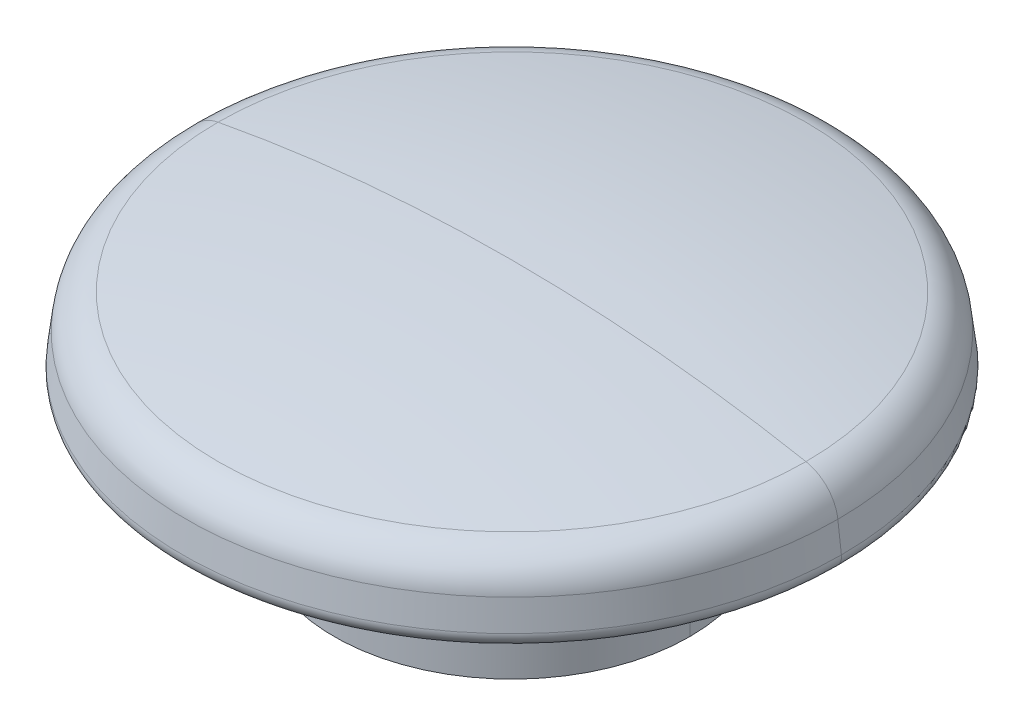
ISO-10303-21;
HEADER;
FILE_DESCRIPTION(('STEP AP214'),'2;1');
FILE_NAME('part.step','',(''),(''),'','','');
FILE_SCHEMA(('AUTOMOTIVE_DESIGN { 1 0 10303 214 1 1 1 1 }'));
ENDSEC;
DATA;
#1=APPLICATION_CONTEXT('core data for automotive mechanical design processes');
#2=APPLICATION_PROTOCOL_DEFINITION('international standard','automotive_design',2000,#1);
#3=PRODUCT_CONTEXT('',#1,'mechanical');
#4=PRODUCT('Part','Part','',(#3));
#5=PRODUCT_RELATED_PRODUCT_CATEGORY('part','',(#4));
#6=PRODUCT_DEFINITION_FORMATION('','',#4);
#7=PRODUCT_DEFINITION_CONTEXT('part definition',#1,'design');
#8=PRODUCT_DEFINITION('design','',#6,#7);
#9=PRODUCT_DEFINITION_SHAPE('','',#8);
#10=(LENGTH_UNIT() NAMED_UNIT(*) SI_UNIT(.MILLI.,.METRE.));
#11=(NAMED_UNIT(*) PLANE_ANGLE_UNIT() SI_UNIT($,.RADIAN.));
#12=(NAMED_UNIT(*) SI_UNIT($,.STERADIAN.) SOLID_ANGLE_UNIT());
#13=UNCERTAINTY_MEASURE_WITH_UNIT(LENGTH_MEASURE(1.E-05),#10,'distance_accuracy_value','');
#14=(GEOMETRIC_REPRESENTATION_CONTEXT(3) GLOBAL_UNCERTAINTY_ASSIGNED_CONTEXT((#13)) GLOBAL_UNIT_ASSIGNED_CONTEXT((#10,
#11,#12)) REPRESENTATION_CONTEXT('',''));
#15=CARTESIAN_POINT('',(0.,0.,0.));
#16=DIRECTION('',(0.,0.,1.));
#17=DIRECTION('',(1.,0.,0.));
#18=AXIS2_PLACEMENT_3D('',#15,#16,#17);
#19=CARTESIAN_POINT('',(0.,-11.2,0.));
#20=DIRECTION('',(0.,-1.,0.));
#21=DIRECTION('',(1.,0.,0.));
#22=AXIS2_PLACEMENT_3D('',#19,#20,#21);
#23=SPHERICAL_SURFACE('',#22,12.);
#24=CARTESIAN_POINT('',(0.,0.5907960026841,0.));
#25=DIRECTION('',(0.,1.,0.));
#26=DIRECTION('',(-1.,0.,0.));
#27=AXIS2_PLACEMENT_3D('',#24,#25,#26);
#28=CIRCLE('',#27,2.230948144419);
#29=CARTESIAN_POINT('',(-2.230948144419,0.5907960026841,0.));
#30=VERTEX_POINT('',#29);
#31=CARTESIAN_POINT('',(2.230948144419,0.5907960026841,0.));
#32=VERTEX_POINT('',#31);
#33=EDGE_CURVE('E200',#30,#32,#28,.T.);
#34=ORIENTED_EDGE('',*,*,#33,.T.);
#35=CARTESIAN_POINT('',(0.,-11.2,0.));
#36=DIRECTION('',(0.,0.,1.));
#37=DIRECTION('',(0.185912345368301,0.982566333557006,0.));
#38=AXIS2_PLACEMENT_3D('',#35,#36,#37);
#39=CIRCLE('',#38,12.);
#40=CARTESIAN_POINT('',(0.,0.8,0.));
#41=VERTEX_POINT('',#40);
#42=EDGE_CURVE('E25',#32,#41,#39,.T.);
#43=ORIENTED_EDGE('',*,*,#42,.T.);
#44=CARTESIAN_POINT('',(0.,-11.2,0.));
#45=DIRECTION('',(0.,0.,-1.));
#46=DIRECTION('',(-0.185912345368301,0.982566333557006,0.));
#47=AXIS2_PLACEMENT_3D('',#44,#45,#46);
#48=CIRCLE('',#47,12.);
#49=EDGE_CURVE('E11',#30,#41,#48,.T.);
#50=ORIENTED_EDGE('',*,*,#49,.F.);
#51=EDGE_LOOP('',(#34,#43,#50));
#52=FACE_BOUND('',#51,.T.);
#53=ADVANCED_FACE('F17',(#52),#23,.T.);
#54=CARTESIAN_POINT('',(0.,-11.2,0.));
#55=DIRECTION('',(0.,-1.,0.));
#56=DIRECTION('',(1.,0.,0.));
#57=AXIS2_PLACEMENT_3D('',#54,#55,#56);
#58=SPHERICAL_SURFACE('',#57,12.);
#59=ORIENTED_EDGE('',*,*,#42,.F.);
#60=CARTESIAN_POINT('',(0.,0.5907960026841,0.));
#61=DIRECTION('',(0.,-1.,0.));
#62=DIRECTION('',(-1.,0.,0.));
#63=AXIS2_PLACEMENT_3D('',#60,#61,#62);
#64=CIRCLE('',#63,2.230948144419);
#65=EDGE_CURVE('E207',#30,#32,#64,.T.);
#66=ORIENTED_EDGE('',*,*,#65,.F.);
#67=ORIENTED_EDGE('',*,*,#49,.T.);
#68=EDGE_LOOP('',(#59,#66,#67));
#69=FACE_BOUND('',#68,.T.);
#70=ADVANCED_FACE('F213',(#69),#58,.T.);
#71=CARTESIAN_POINT('',(0.,0.296026102617,0.));
#72=DIRECTION('',(0.,-1.,0.));
#73=DIRECTION('',(1.,0.,0.));
#74=AXIS2_PLACEMENT_3D('',#71,#72,#73);
#75=TOROIDAL_SURFACE('',#74,2.175174440809,0.3);
#76=ORIENTED_EDGE('',*,*,#65,.T.);
#77=CARTESIAN_POINT('',(2.175174440809,0.296026102617,0.));
#78=DIRECTION('',(0.,0.,1.));
#79=DIRECTION('',(0.992546151641328,0.121869343405103,0.));
#80=AXIS2_PLACEMENT_3D('',#77,#78,#79);
#81=CIRCLE('',#80,0.3);
#82=CARTESIAN_POINT('',(2.472938286301,0.3325869056386,0.));
#83=VERTEX_POINT('',#82);
#84=EDGE_CURVE('E196',#83,#32,#81,.T.);
#85=ORIENTED_EDGE('',*,*,#84,.F.);
#86=CARTESIAN_POINT('',(0.,0.3325869056386,0.));
#87=DIRECTION('',(0.,-1.,0.));
#88=DIRECTION('',(-1.,0.,0.));
#89=AXIS2_PLACEMENT_3D('',#86,#87,#88);
#90=CIRCLE('',#89,2.472938286301);
#91=CARTESIAN_POINT('',(-2.472938286301,0.3325869056386,0.));
#92=VERTEX_POINT('',#91);
#93=EDGE_CURVE('E152',#92,#83,#90,.T.);
#94=ORIENTED_EDGE('',*,*,#93,.F.);
#95=CARTESIAN_POINT('',(-2.175174440809,0.296026102617,0.));
#96=DIRECTION('',(0.,0.,-1.));
#97=DIRECTION('',(-0.992546151641328,0.121869343405103,0.));
#98=AXIS2_PLACEMENT_3D('',#95,#96,#97);
#99=CIRCLE('',#98,0.3);
#100=EDGE_CURVE('E203',#92,#30,#99,.T.);
#101=ORIENTED_EDGE('',*,*,#100,.T.);
#102=EDGE_LOOP('',(#76,#85,#94,#101));
#103=FACE_BOUND('',#102,.T.);
#104=ADVANCED_FACE('F215',(#103),#75,.T.);
#105=CARTESIAN_POINT('',(0.,0.296026102617,0.));
#106=DIRECTION('',(0.,-1.,0.));
#107=DIRECTION('',(1.,0.,0.));
#108=AXIS2_PLACEMENT_3D('',#105,#106,#107);
#109=TOROIDAL_SURFACE('',#108,2.175174440809,0.3);
#110=CARTESIAN_POINT('',(0.,0.3325869056386,0.));
#111=DIRECTION('',(0.,1.,0.));
#112=DIRECTION('',(-1.,0.,0.));
#113=AXIS2_PLACEMENT_3D('',#110,#111,#112);
#114=CIRCLE('',#113,2.472938286301);
#115=EDGE_CURVE('E192',#92,#83,#114,.T.);
#116=ORIENTED_EDGE('',*,*,#115,.T.);
#117=ORIENTED_EDGE('',*,*,#84,.T.);
#118=ORIENTED_EDGE('',*,*,#33,.F.);
#119=ORIENTED_EDGE('',*,*,#100,.F.);
#120=EDGE_LOOP('',(#116,#117,#118,#119));
#121=FACE_BOUND('',#120,.T.);
#122=ADVANCED_FACE('F220',(#121),#109,.T.);
#123=CARTESIAN_POINT('',(0.,0.2223869199895,0.));
#124=DIRECTION('',(0.,-1.,0.));
#125=DIRECTION('',(1.,0.,0.));
#126=AXIS2_PLACEMENT_3D('',#123,#124,#125);
#127=CONICAL_SURFACE('',#126,2.486469143151,0.12217304763958);
#128=CARTESIAN_POINT('',(0.,0.1121869343405,0.));
#129=DIRECTION('',(0.,1.,0.));
#130=DIRECTION('',(-1.,0.,0.));
#131=AXIS2_PLACEMENT_3D('',#128,#129,#130);
#132=CIRCLE('',#131,2.5);
#133=CARTESIAN_POINT('',(-2.5,0.1121869343405,0.));
#134=VERTEX_POINT('',#133);
#135=CARTESIAN_POINT('',(2.5,0.1121869343405,0.));
#136=VERTEX_POINT('',#135);
#137=EDGE_CURVE('E179',#134,#136,#132,.T.);
#138=ORIENTED_EDGE('',*,*,#137,.T.);
#139=DIRECTION('',(-0.121869343405202,0.992546151641315,0.));
#140=VECTOR('',#139,1.);
#141=CARTESIAN_POINT('',(2.5,0.1121869343405,0.));
#142=LINE('',#141,#140);
#143=EDGE_CURVE('E154',#136,#83,#142,.T.);
#144=ORIENTED_EDGE('',*,*,#143,.T.);
#145=ORIENTED_EDGE('',*,*,#115,.F.);
#146=DIRECTION('',(0.121869343405202,0.992546151641315,0.));
#147=VECTOR('',#146,1.);
#148=CARTESIAN_POINT('',(-2.5,0.1121869343405,0.));
#149=LINE('',#148,#147);
#150=EDGE_CURVE('E156',#134,#92,#149,.T.);
#151=ORIENTED_EDGE('',*,*,#150,.F.);
#152=EDGE_LOOP('',(#138,#144,#145,#151));
#153=FACE_BOUND('',#152,.T.);
#154=ADVANCED_FACE('F222',(#153),#127,.T.);
#155=CARTESIAN_POINT('',(0.,0.2223869199895,0.));
#156=DIRECTION('',(0.,-1.,0.));
#157=DIRECTION('',(1.,0.,0.));
#158=AXIS2_PLACEMENT_3D('',#155,#156,#157);
#159=CONICAL_SURFACE('',#158,2.486469143151,0.12217304763958);
#160=ORIENTED_EDGE('',*,*,#93,.T.);
#161=ORIENTED_EDGE('',*,*,#143,.F.);
#162=CARTESIAN_POINT('',(0.,0.1121869343405,0.));
#163=DIRECTION('',(0.,-1.,0.));
#164=DIRECTION('',(-1.,0.,0.));
#165=AXIS2_PLACEMENT_3D('',#162,#163,#164);
#166=CIRCLE('',#165,2.5);
#167=EDGE_CURVE('E188',#134,#136,#166,.T.);
#168=ORIENTED_EDGE('',*,*,#167,.F.);
#169=ORIENTED_EDGE('',*,*,#150,.T.);
#170=EDGE_LOOP('',(#160,#161,#168,#169));
#171=FACE_BOUND('',#170,.T.);
#172=ADVANCED_FACE('F227',(#171),#159,.T.);
#173=CARTESIAN_POINT('',(0.,0.1,0.));
#174=DIRECTION('',(0.,-1.,0.));
#175=DIRECTION('',(1.,0.,0.));
#176=AXIS2_PLACEMENT_3D('',#173,#174,#175);
#177=TOROIDAL_SURFACE('',#176,2.400745384836,0.1);
#178=ORIENTED_EDGE('',*,*,#167,.T.);
#179=CARTESIAN_POINT('',(2.400745384836,0.1,0.));
#180=DIRECTION('',(0.,0.,1.));
#181=DIRECTION('',(0.,-1.,0.));
#182=AXIS2_PLACEMENT_3D('',#179,#180,#181);
#183=CIRCLE('',#182,0.1);
#184=CARTESIAN_POINT('',(2.400745384836,0.,0.));
#185=VERTEX_POINT('',#184);
#186=EDGE_CURVE('E175',#185,#136,#183,.T.);
#187=ORIENTED_EDGE('',*,*,#186,.F.);
#188=CARTESIAN_POINT('',(0.,0.,0.));
#189=DIRECTION('',(0.,-1.,0.));
#190=DIRECTION('',(-1.,0.,0.));
#191=AXIS2_PLACEMENT_3D('',#188,#189,#190);
#192=CIRCLE('',#191,2.400745384836);
#193=CARTESIAN_POINT('',(-2.400745384836,0.,0.));
#194=VERTEX_POINT('',#193);
#195=EDGE_CURVE('E174',#194,#185,#192,.T.);
#196=ORIENTED_EDGE('',*,*,#195,.F.);
#197=CARTESIAN_POINT('',(-2.400745384836,0.1,0.));
#198=DIRECTION('',(0.,0.,-1.));
#199=DIRECTION('',(0.,-1.,0.));
#200=AXIS2_PLACEMENT_3D('',#197,#198,#199);
#201=CIRCLE('',#200,0.1);
#202=EDGE_CURVE('E184',#194,#134,#201,.T.);
#203=ORIENTED_EDGE('',*,*,#202,.T.);
#204=EDGE_LOOP('',(#178,#187,#196,#203));
#205=FACE_BOUND('',#204,.T.);
#206=ADVANCED_FACE('F288',(#205),#177,.T.);
#207=CARTESIAN_POINT('',(0.,0.1,0.));
#208=DIRECTION('',(0.,-1.,0.));
#209=DIRECTION('',(1.,0.,0.));
#210=AXIS2_PLACEMENT_3D('',#207,#208,#209);
#211=TOROIDAL_SURFACE('',#210,2.400745384836,0.1);
#212=CARTESIAN_POINT('',(0.,0.,0.));
#213=DIRECTION('',(0.,1.,0.));
#214=DIRECTION('',(-1.,0.,0.));
#215=AXIS2_PLACEMENT_3D('',#212,#213,#214);
#216=CIRCLE('',#215,2.400745384836);
#217=EDGE_CURVE('E180',#194,#185,#216,.T.);
#218=ORIENTED_EDGE('',*,*,#217,.T.);
#219=ORIENTED_EDGE('',*,*,#186,.T.);
#220=ORIENTED_EDGE('',*,*,#137,.F.);
#221=ORIENTED_EDGE('',*,*,#202,.F.);
#222=EDGE_LOOP('',(#218,#219,#220,#221));
#223=FACE_BOUND('',#222,.T.);
#224=ADVANCED_FACE('F290',(#223),#211,.T.);
#225=CARTESIAN_POINT('',(0.,0.,0.));
#226=DIRECTION('',(0.,-1.,0.));
#227=DIRECTION('',(0.,0.,-1.));
#228=AXIS2_PLACEMENT_3D('',#225,#226,#227);
#229=PLANE('',#228);
#230=CARTESIAN_POINT('',(0.,0.,0.));
#231=DIRECTION('',(0.,1.,0.));
#232=DIRECTION('',(-1.,0.,0.));
#233=AXIS2_PLACEMENT_3D('',#230,#231,#232);
#234=CIRCLE('',#233,1.35);
#235=CARTESIAN_POINT('',(-1.35,0.,0.));
#236=VERTEX_POINT('',#235);
#237=CARTESIAN_POINT('',(1.35,0.,0.));
#238=VERTEX_POINT('',#237);
#239=EDGE_CURVE('E162',#236,#238,#234,.T.);
#240=ORIENTED_EDGE('',*,*,#239,.T.);
#241=CARTESIAN_POINT('',(0.,0.,0.));
#242=DIRECTION('',(0.,-1.,0.));
#243=DIRECTION('',(-1.,0.,0.));
#244=AXIS2_PLACEMENT_3D('',#241,#242,#243);
#245=CIRCLE('',#244,1.35);
#246=EDGE_CURVE('E171',#236,#238,#245,.T.);
#247=ORIENTED_EDGE('',*,*,#246,.F.);
#248=EDGE_LOOP('',(#240,#247));
#249=FACE_BOUND('',#248,.T.);
#250=ORIENTED_EDGE('',*,*,#195,.T.);
#251=ORIENTED_EDGE('',*,*,#217,.F.);
#252=EDGE_LOOP('',(#250,#251));
#253=FACE_BOUND('',#252,.T.);
#254=ADVANCED_FACE('F287',(#249,#253),#229,.T.);
#255=CARTESIAN_POINT('',(0.,-0.1,0.));
#256=DIRECTION('',(0.,-1.,0.));
#257=DIRECTION('',(1.,0.,0.));
#258=AXIS2_PLACEMENT_3D('',#255,#256,#257);
#259=TOROIDAL_SURFACE('',#258,1.35,0.1);
#260=ORIENTED_EDGE('',*,*,#246,.T.);
#261=CARTESIAN_POINT('',(1.35,-0.1,0.));
#262=DIRECTION('',(0.,0.,-1.));
#263=DIRECTION('',(-1.,0.,0.));
#264=AXIS2_PLACEMENT_3D('',#261,#262,#263);
#265=CIRCLE('',#264,0.1);
#266=CARTESIAN_POINT('',(1.25,-0.1,0.));
#267=VERTEX_POINT('',#266);
#268=EDGE_CURVE('E158',#267,#238,#265,.T.);
#269=ORIENTED_EDGE('',*,*,#268,.F.);
#270=CARTESIAN_POINT('',(0.,-0.1,0.));
#271=DIRECTION('',(0.,-1.,0.));
#272=DIRECTION('',(-1.,0.,0.));
#273=AXIS2_PLACEMENT_3D('',#270,#271,#272);
#274=CIRCLE('',#273,1.25);
#275=CARTESIAN_POINT('',(-1.25,-0.1,0.));
#276=VERTEX_POINT('',#275);
#277=EDGE_CURVE('E261',#276,#267,#274,.T.);
#278=ORIENTED_EDGE('',*,*,#277,.F.);
#279=CARTESIAN_POINT('',(-1.35,-0.1,0.));
#280=DIRECTION('',(0.,0.,1.));
#281=DIRECTION('',(1.,0.,0.));
#282=AXIS2_PLACEMENT_3D('',#279,#280,#281);
#283=CIRCLE('',#282,0.1);
#284=EDGE_CURVE('E167',#276,#236,#283,.T.);
#285=ORIENTED_EDGE('',*,*,#284,.T.);
#286=EDGE_LOOP('',(#260,#269,#278,#285));
#287=FACE_BOUND('',#286,.T.);
#288=ADVANCED_FACE('F299',(#287),#259,.F.);
#289=CARTESIAN_POINT('',(0.,-0.1,0.));
#290=DIRECTION('',(0.,-1.,0.));
#291=DIRECTION('',(1.,0.,0.));
#292=AXIS2_PLACEMENT_3D('',#289,#290,#291);
#293=TOROIDAL_SURFACE('',#292,1.35,0.1);
#294=CARTESIAN_POINT('',(0.,-0.1,0.));
#295=DIRECTION('',(0.,1.,0.));
#296=DIRECTION('',(-1.,0.,0.));
#297=AXIS2_PLACEMENT_3D('',#294,#295,#296);
#298=CIRCLE('',#297,1.25);
#299=EDGE_CURVE('E163',#276,#267,#298,.T.);
#300=ORIENTED_EDGE('',*,*,#299,.T.);
#301=ORIENTED_EDGE('',*,*,#268,.T.);
#302=ORIENTED_EDGE('',*,*,#239,.F.);
#303=ORIENTED_EDGE('',*,*,#284,.F.);
#304=EDGE_LOOP('',(#300,#301,#302,#303));
#305=FACE_BOUND('',#304,.T.);
#306=ADVANCED_FACE('F438',(#305),#293,.F.);
#307=CARTESIAN_POINT('',(0.,0.87,0.));
#308=DIRECTION('',(0.,-1.,0.));
#309=DIRECTION('',(1.,0.,0.));
#310=AXIS2_PLACEMENT_3D('',#307,#308,#309);
#311=CYLINDRICAL_SURFACE('',#310,1.25);
#312=DIRECTION('',(0.,1.,0.));
#313=VECTOR('',#312,1.);
#314=CARTESIAN_POINT('',(1.25,-0.6,0.));
#315=LINE('',#314,#313);
#316=CARTESIAN_POINT('',(1.25,-0.6,0.));
#317=VERTEX_POINT('',#316);
#318=EDGE_CURVE('E264',#317,#267,#315,.T.);
#319=ORIENTED_EDGE('',*,*,#318,.T.);
#320=ORIENTED_EDGE('',*,*,#299,.F.);
#321=DIRECTION('',(0.,1.,0.));
#322=VECTOR('',#321,1.);
#323=CARTESIAN_POINT('',(-1.25,-0.6,0.));
#324=LINE('',#323,#322);
#325=CARTESIAN_POINT('',(-1.25,-0.6,0.));
#326=VERTEX_POINT('',#325);
#327=EDGE_CURVE('E249',#326,#276,#324,.T.);
#328=ORIENTED_EDGE('',*,*,#327,.F.);
#329=CARTESIAN_POINT('',(0.,-0.6,0.));
#330=DIRECTION('',(0.,-1.,0.));
#331=DIRECTION('',(1.,0.,0.));
#332=AXIS2_PLACEMENT_3D('',#329,#330,#331);
#333=CIRCLE('',#332,1.25);
#334=EDGE_CURVE('E254',#317,#326,#333,.T.);
#335=ORIENTED_EDGE('',*,*,#334,.F.);
#336=EDGE_LOOP('',(#319,#320,#328,#335));
#337=FACE_BOUND('',#336,.T.);
#338=ADVANCED_FACE('F429',(#337),#311,.T.);
#339=CARTESIAN_POINT('',(0.,-0.657,0.));
#340=DIRECTION('',(0.,-1.,0.));
#341=DIRECTION('',(0.,0.,1.));
#342=AXIS2_PLACEMENT_3D('',#339,#340,#341);
#343=CONICAL_SURFACE('',#342,0.5098488384069,0.9599310885967);
#344=DIRECTION('',(0.,-0.573576436351011,0.819152044289016));
#345=VECTOR('',#344,1.);
#346=CARTESIAN_POINT('',(0.,-0.3,0.));
#347=LINE('',#346,#345);
#348=CARTESIAN_POINT('',(0.,-0.3,0.));
#349=VERTEX_POINT('',#348);
#350=CARTESIAN_POINT('',(0.,-1.,0.9997036047195));
#351=VERTEX_POINT('',#350);
#352=EDGE_CURVE('E129',#349,#351,#347,.T.);
#353=ORIENTED_EDGE('',*,*,#352,.F.);
#354=DIRECTION('',(0.,-0.573576436351011,-0.819152044289016));
#355=VECTOR('',#354,1.);
#356=CARTESIAN_POINT('',(0.,-0.3,0.));
#357=LINE('',#356,#355);
#358=CARTESIAN_POINT('',(0.,-1.,-0.9997036047195));
#359=VERTEX_POINT('',#358);
#360=EDGE_CURVE('E124',#349,#359,#357,.T.);
#361=ORIENTED_EDGE('',*,*,#360,.T.);
#362=CARTESIAN_POINT('',(0.,-1.,0.));
#363=DIRECTION('',(0.,-1.,0.));
#364=DIRECTION('',(0.,0.,-1.));
#365=AXIS2_PLACEMENT_3D('',#362,#363,#364);
#366=CIRCLE('',#365,0.9997036047195);
#367=EDGE_CURVE('E128',#359,#351,#366,.T.);
#368=ORIENTED_EDGE('',*,*,#367,.T.);
#369=EDGE_LOOP('',(#353,#361,#368));
#370=FACE_BOUND('',#369,.T.);
#371=ADVANCED_FACE('F126',(#370),#343,.F.);
#372=CARTESIAN_POINT('',(0.,-0.657,0.));
#373=DIRECTION('',(0.,-1.,0.));
#374=DIRECTION('',(0.,0.,1.));
#375=AXIS2_PLACEMENT_3D('',#372,#373,#374);
#376=CONICAL_SURFACE('',#375,0.5098488384069,0.9599310885967);
#377=ORIENTED_EDGE('',*,*,#360,.F.);
#378=ORIENTED_EDGE('',*,*,#352,.T.);
#379=CARTESIAN_POINT('',(0.,-1.,0.));
#380=DIRECTION('',(0.,-1.,0.));
#381=DIRECTION('',(0.,0.,1.));
#382=AXIS2_PLACEMENT_3D('',#379,#380,#381);
#383=CIRCLE('',#382,0.9997036047195);
#384=EDGE_CURVE('E132',#351,#359,#383,.T.);
#385=ORIENTED_EDGE('',*,*,#384,.T.);
#386=EDGE_LOOP('',(#377,#378,#385));
#387=FACE_BOUND('',#386,.T.);
#388=ADVANCED_FACE('F135',(#387),#376,.F.);
#389=CARTESIAN_POINT('',(0.,-1.,0.));
#390=DIRECTION('',(0.,-1.,0.));
#391=DIRECTION('',(0.,0.,-1.));
#392=AXIS2_PLACEMENT_3D('',#389,#390,#391);
#393=PLANE('',#392);
#394=ORIENTED_EDGE('',*,*,#367,.F.);
#395=ORIENTED_EDGE('',*,*,#384,.F.);
#396=EDGE_LOOP('',(#394,#395));
#397=FACE_BOUND('',#396,.T.);
#398=CARTESIAN_POINT('',(0.,-1.,0.));
#399=DIRECTION('',(0.,-1.,0.));
#400=DIRECTION('',(-1.,0.,0.));
#401=AXIS2_PLACEMENT_3D('',#398,#399,#400);
#402=CIRCLE('',#401,1.35);
#403=CARTESIAN_POINT('',(-1.35,-1.,0.));
#404=VERTEX_POINT('',#403);
#405=CARTESIAN_POINT('',(1.35,-1.,0.));
#406=VERTEX_POINT('',#405);
#407=EDGE_CURVE('E142',#404,#406,#402,.T.);
#408=ORIENTED_EDGE('',*,*,#407,.T.);
#409=CARTESIAN_POINT('',(0.,-1.,0.));
#410=DIRECTION('',(0.,-1.,0.));
#411=DIRECTION('',(1.,0.,0.));
#412=AXIS2_PLACEMENT_3D('',#409,#410,#411);
#413=CIRCLE('',#412,1.35);
#414=EDGE_CURVE('E253',#406,#404,#413,.T.);
#415=ORIENTED_EDGE('',*,*,#414,.T.);
#416=EDGE_LOOP('',(#408,#415));
#417=FACE_BOUND('',#416,.T.);
#418=ADVANCED_FACE('F139',(#397,#417),#393,.T.);
#419=CARTESIAN_POINT('',(0.,-0.6,0.));
#420=DIRECTION('',(0.,-1.,0.));
#421=DIRECTION('',(1.,0.,0.));
#422=AXIS2_PLACEMENT_3D('',#419,#420,#421);
#423=CYLINDRICAL_SURFACE('',#422,1.35);
#424=DIRECTION('',(0.,-1.,0.));
#425=VECTOR('',#424,1.);
#426=CARTESIAN_POINT('',(1.35,-0.6,0.));
#427=LINE('',#426,#425);
#428=CARTESIAN_POINT('',(1.35,-0.6,0.));
#429=VERTEX_POINT('',#428);
#430=EDGE_CURVE('E148',#429,#406,#427,.T.);
#431=ORIENTED_EDGE('',*,*,#430,.T.);
#432=ORIENTED_EDGE('',*,*,#407,.F.);
#433=DIRECTION('',(0.,-1.,0.));
#434=VECTOR('',#433,1.);
#435=CARTESIAN_POINT('',(-1.35,-0.6,0.));
#436=LINE('',#435,#434);
#437=CARTESIAN_POINT('',(-1.35,-0.6,0.));
#438=VERTEX_POINT('',#437);
#439=EDGE_CURVE('E250',#438,#404,#436,.T.);
#440=ORIENTED_EDGE('',*,*,#439,.F.);
#441=CARTESIAN_POINT('',(0.,-0.6,0.));
#442=DIRECTION('',(0.,-1.,0.));
#443=DIRECTION('',(-1.,0.,0.));
#444=AXIS2_PLACEMENT_3D('',#441,#442,#443);
#445=CIRCLE('',#444,1.35);
#446=EDGE_CURVE('E272',#438,#429,#445,.T.);
#447=ORIENTED_EDGE('',*,*,#446,.T.);
#448=EDGE_LOOP('',(#431,#432,#440,#447));
#449=FACE_BOUND('',#448,.T.);
#450=ADVANCED_FACE('F396',(#449),#423,.T.);
#451=CARTESIAN_POINT('',(0.,-0.6,0.));
#452=DIRECTION('',(0.,-1.,0.));
#453=DIRECTION('',(1.,0.,0.));
#454=AXIS2_PLACEMENT_3D('',#451,#452,#453);
#455=CYLINDRICAL_SURFACE('',#454,1.35);
#456=ORIENTED_EDGE('',*,*,#439,.T.);
#457=ORIENTED_EDGE('',*,*,#414,.F.);
#458=ORIENTED_EDGE('',*,*,#430,.F.);
#459=CARTESIAN_POINT('',(0.,-0.6,0.));
#460=DIRECTION('',(0.,-1.,0.));
#461=DIRECTION('',(1.,0.,0.));
#462=AXIS2_PLACEMENT_3D('',#459,#460,#461);
#463=CIRCLE('',#462,1.35);
#464=EDGE_CURVE('E257',#429,#438,#463,.T.);
#465=ORIENTED_EDGE('',*,*,#464,.T.);
#466=EDGE_LOOP('',(#456,#457,#458,#465));
#467=FACE_BOUND('',#466,.T.);
#468=ADVANCED_FACE('F386',(#467),#455,.T.);
#469=CARTESIAN_POINT('',(0.,-0.6,0.));
#470=DIRECTION('',(0.,-1.,0.));
#471=DIRECTION('',(0.,0.,-1.));
#472=AXIS2_PLACEMENT_3D('',#469,#470,#471);
#473=PLANE('',#472);
#474=ORIENTED_EDGE('',*,*,#334,.T.);
#475=CARTESIAN_POINT('',(0.,-0.6,0.));
#476=DIRECTION('',(0.,-1.,0.));
#477=DIRECTION('',(-1.,0.,0.));
#478=AXIS2_PLACEMENT_3D('',#475,#476,#477);
#479=CIRCLE('',#478,1.25);
#480=EDGE_CURVE('E268',#326,#317,#479,.T.);
#481=ORIENTED_EDGE('',*,*,#480,.T.);
#482=EDGE_LOOP('',(#474,#481));
#483=FACE_BOUND('',#482,.T.);
#484=ORIENTED_EDGE('',*,*,#446,.F.);
#485=ORIENTED_EDGE('',*,*,#464,.F.);
#486=EDGE_LOOP('',(#484,#485));
#487=FACE_BOUND('',#486,.T.);
#488=ADVANCED_FACE('F376',(#483,#487),#473,.F.);
#489=CARTESIAN_POINT('',(0.,0.87,0.));
#490=DIRECTION('',(0.,-1.,0.));
#491=DIRECTION('',(1.,0.,0.));
#492=AXIS2_PLACEMENT_3D('',#489,#490,#491);
#493=CYLINDRICAL_SURFACE('',#492,1.25);
#494=ORIENTED_EDGE('',*,*,#327,.T.);
#495=ORIENTED_EDGE('',*,*,#277,.T.);
#496=ORIENTED_EDGE('',*,*,#318,.F.);
#497=ORIENTED_EDGE('',*,*,#480,.F.);
#498=EDGE_LOOP('',(#494,#495,#496,#497));
#499=FACE_BOUND('',#498,.T.);
#500=ADVANCED_FACE('F371',(#499),#493,.T.);
#501=CLOSED_SHELL('',(#53,#70,#104,#122,#154,#172,#206,#224,#254,#288,#306,#338,#371,#388,#418,
#450,#468,#488,#500));
#502=MANIFOLD_SOLID_BREP('B1',#501);
#503=ADVANCED_BREP_SHAPE_REPRESENTATION('',(#18,#502),#14);
#504=SHAPE_DEFINITION_REPRESENTATION(#9,#503);
ENDSEC;
END-ISO-10303-21;
